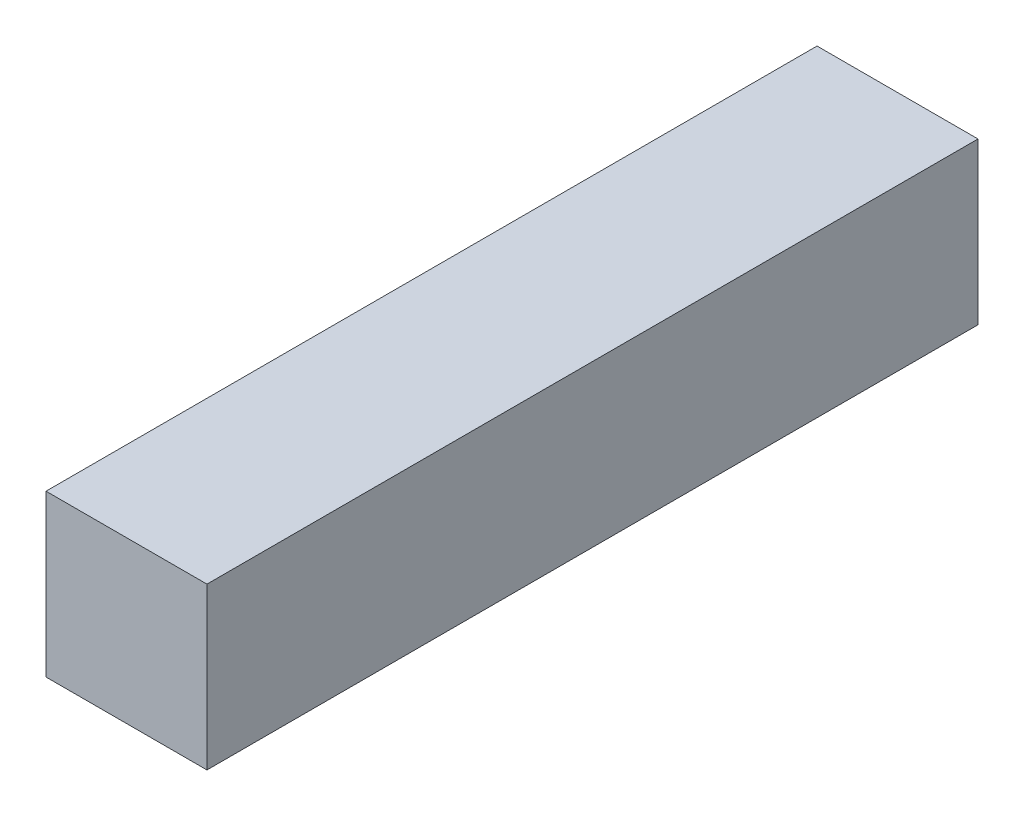
ISO-10303-21;
HEADER;
FILE_DESCRIPTION(('STEP AP214'),'2;1');
FILE_NAME('part.step','',(''),(''),'','','');
FILE_SCHEMA(('AUTOMOTIVE_DESIGN { 1 0 10303 214 1 1 1 1 }'));
ENDSEC;
DATA;
#1=APPLICATION_CONTEXT('core data for automotive mechanical design processes');
#2=APPLICATION_PROTOCOL_DEFINITION('international standard','automotive_design',2000,#1);
#3=PRODUCT_CONTEXT('',#1,'mechanical');
#4=PRODUCT('Part','Part','',(#3));
#5=PRODUCT_RELATED_PRODUCT_CATEGORY('part','',(#4));
#6=PRODUCT_DEFINITION_FORMATION('','',#4);
#7=PRODUCT_DEFINITION_CONTEXT('part definition',#1,'design');
#8=PRODUCT_DEFINITION('design','',#6,#7);
#9=PRODUCT_DEFINITION_SHAPE('','',#8);
#10=(LENGTH_UNIT() NAMED_UNIT(*) SI_UNIT(.MILLI.,.METRE.));
#11=(NAMED_UNIT(*) PLANE_ANGLE_UNIT() SI_UNIT($,.RADIAN.));
#12=(NAMED_UNIT(*) SI_UNIT($,.STERADIAN.) SOLID_ANGLE_UNIT());
#13=UNCERTAINTY_MEASURE_WITH_UNIT(LENGTH_MEASURE(1.E-05),#10,'distance_accuracy_value','');
#14=(GEOMETRIC_REPRESENTATION_CONTEXT(3) GLOBAL_UNCERTAINTY_ASSIGNED_CONTEXT((#13)) GLOBAL_UNIT_ASSIGNED_CONTEXT((#10,
#11,#12)) REPRESENTATION_CONTEXT('',''));
#15=CARTESIAN_POINT('',(0.,0.,0.));
#16=DIRECTION('',(0.,0.,1.));
#17=DIRECTION('',(1.,0.,0.));
#18=AXIS2_PLACEMENT_3D('',#15,#16,#17);
#19=CARTESIAN_POINT('',(8.35,-8.35,40.));
#20=DIRECTION('',(-1.,0.,0.));
#21=DIRECTION('',(0.,0.,1.));
#22=AXIS2_PLACEMENT_3D('',#19,#20,#21);
#23=PLANE('',#22);
#24=DIRECTION('',(0.,1.,0.));
#25=VECTOR('',#24,1.);
#26=CARTESIAN_POINT('',(8.35,-8.35,-40.));
#27=LINE('',#26,#25);
#28=CARTESIAN_POINT('',(8.35,-8.35,-40.));
#29=VERTEX_POINT('',#28);
#30=CARTESIAN_POINT('',(8.35,8.35,-40.));
#31=VERTEX_POINT('',#30);
#32=EDGE_CURVE('E100',#29,#31,#27,.T.);
#33=ORIENTED_EDGE('',*,*,#32,.T.);
#34=DIRECTION('',(0.,0.,-1.));
#35=VECTOR('',#34,1.);
#36=CARTESIAN_POINT('',(8.35,8.35,40.));
#37=LINE('',#36,#35);
#38=CARTESIAN_POINT('',(8.35,8.35,40.));
#39=VERTEX_POINT('',#38);
#40=EDGE_CURVE('E11',#39,#31,#37,.T.);
#41=ORIENTED_EDGE('',*,*,#40,.F.);
#42=DIRECTION('',(0.,1.,0.));
#43=VECTOR('',#42,1.);
#44=CARTESIAN_POINT('',(8.35,-8.35,40.));
#45=LINE('',#44,#43);
#46=CARTESIAN_POINT('',(8.35,-8.35,40.));
#47=VERTEX_POINT('',#46);
#48=EDGE_CURVE('E88',#47,#39,#45,.T.);
#49=ORIENTED_EDGE('',*,*,#48,.F.);
#50=DIRECTION('',(0.,0.,-1.));
#51=VECTOR('',#50,1.);
#52=CARTESIAN_POINT('',(8.35,-8.35,40.));
#53=LINE('',#52,#51);
#54=EDGE_CURVE('E96',#47,#29,#53,.T.);
#55=ORIENTED_EDGE('',*,*,#54,.T.);
#56=EDGE_LOOP('',(#33,#41,#49,#55));
#57=FACE_BOUND('',#56,.T.);
#58=ADVANCED_FACE('F37',(#57),#23,.F.);
#59=CARTESIAN_POINT('',(-8.35,8.35,40.));
#60=DIRECTION('',(0.,-1.,0.));
#61=DIRECTION('',(0.,0.,-1.));
#62=AXIS2_PLACEMENT_3D('',#59,#60,#61);
#63=PLANE('',#62);
#64=DIRECTION('',(-1.,0.,0.));
#65=VECTOR('',#64,1.);
#66=CARTESIAN_POINT('',(-8.35,8.35,-40.));
#67=LINE('',#66,#65);
#68=CARTESIAN_POINT('',(-8.35,8.35,-40.));
#69=VERTEX_POINT('',#68);
#70=EDGE_CURVE('E92',#31,#69,#67,.T.);
#71=ORIENTED_EDGE('',*,*,#70,.T.);
#72=DIRECTION('',(0.,0.,-1.));
#73=VECTOR('',#72,1.);
#74=CARTESIAN_POINT('',(-8.35,8.35,40.));
#75=LINE('',#74,#73);
#76=CARTESIAN_POINT('',(-8.35,8.35,40.));
#77=VERTEX_POINT('',#76);
#78=EDGE_CURVE('E45',#77,#69,#75,.T.);
#79=ORIENTED_EDGE('',*,*,#78,.F.);
#80=DIRECTION('',(-1.,0.,0.));
#81=VECTOR('',#80,1.);
#82=CARTESIAN_POINT('',(-8.35,8.35,40.));
#83=LINE('',#82,#81);
#84=EDGE_CURVE('E83',#39,#77,#83,.T.);
#85=ORIENTED_EDGE('',*,*,#84,.F.);
#86=ORIENTED_EDGE('',*,*,#40,.T.);
#87=EDGE_LOOP('',(#71,#79,#85,#86));
#88=FACE_BOUND('',#87,.T.);
#89=ADVANCED_FACE('F91',(#88),#63,.F.);
#90=CARTESIAN_POINT('',(-8.35,-8.35,40.));
#91=DIRECTION('',(1.,0.,0.));
#92=DIRECTION('',(0.,0.,-1.));
#93=AXIS2_PLACEMENT_3D('',#90,#91,#92);
#94=PLANE('',#93);
#95=DIRECTION('',(0.,-1.,0.));
#96=VECTOR('',#95,1.);
#97=CARTESIAN_POINT('',(-8.35,-8.35,-40.));
#98=LINE('',#97,#96);
#99=CARTESIAN_POINT('',(-8.35,-8.35,-40.));
#100=VERTEX_POINT('',#99);
#101=EDGE_CURVE('E70',#69,#100,#98,.T.);
#102=ORIENTED_EDGE('',*,*,#101,.T.);
#103=DIRECTION('',(0.,0.,-1.));
#104=VECTOR('',#103,1.);
#105=CARTESIAN_POINT('',(-8.35,-8.35,40.));
#106=LINE('',#105,#104);
#107=CARTESIAN_POINT('',(-8.35,-8.35,40.));
#108=VERTEX_POINT('',#107);
#109=EDGE_CURVE('E93',#108,#100,#106,.T.);
#110=ORIENTED_EDGE('',*,*,#109,.F.);
#111=DIRECTION('',(0.,-1.,0.));
#112=VECTOR('',#111,1.);
#113=CARTESIAN_POINT('',(-8.35,-8.35,40.));
#114=LINE('',#113,#112);
#115=EDGE_CURVE('E86',#77,#108,#114,.T.);
#116=ORIENTED_EDGE('',*,*,#115,.F.);
#117=ORIENTED_EDGE('',*,*,#78,.T.);
#118=EDGE_LOOP('',(#102,#110,#116,#117));
#119=FACE_BOUND('',#118,.T.);
#120=ADVANCED_FACE('F94',(#119),#94,.F.);
#121=CARTESIAN_POINT('',(-8.35,-8.35,40.));
#122=DIRECTION('',(0.,1.,0.));
#123=DIRECTION('',(0.,0.,1.));
#124=AXIS2_PLACEMENT_3D('',#121,#122,#123);
#125=PLANE('',#124);
#126=DIRECTION('',(1.,0.,0.));
#127=VECTOR('',#126,1.);
#128=CARTESIAN_POINT('',(-8.35,-8.35,-40.));
#129=LINE('',#128,#127);
#130=EDGE_CURVE('E76',#100,#29,#129,.T.);
#131=ORIENTED_EDGE('',*,*,#130,.T.);
#132=ORIENTED_EDGE('',*,*,#54,.F.);
#133=DIRECTION('',(1.,0.,0.));
#134=VECTOR('',#133,1.);
#135=CARTESIAN_POINT('',(-8.35,-8.35,40.));
#136=LINE('',#135,#134);
#137=EDGE_CURVE('E53',#108,#47,#136,.T.);
#138=ORIENTED_EDGE('',*,*,#137,.F.);
#139=ORIENTED_EDGE('',*,*,#109,.T.);
#140=EDGE_LOOP('',(#131,#132,#138,#139));
#141=FACE_BOUND('',#140,.T.);
#142=ADVANCED_FACE('F107',(#141),#125,.F.);
#143=CARTESIAN_POINT('',(0.,0.,40.));
#144=DIRECTION('',(0.,0.,-1.));
#145=DIRECTION('',(-1.,0.,0.));
#146=AXIS2_PLACEMENT_3D('',#143,#144,#145);
#147=PLANE('',#146);
#148=ORIENTED_EDGE('',*,*,#48,.T.);
#149=ORIENTED_EDGE('',*,*,#84,.T.);
#150=ORIENTED_EDGE('',*,*,#115,.T.);
#151=ORIENTED_EDGE('',*,*,#137,.T.);
#152=EDGE_LOOP('',(#148,#149,#150,#151));
#153=FACE_BOUND('',#152,.T.);
#154=ADVANCED_FACE('F84',(#153),#147,.F.);
#155=CARTESIAN_POINT('',(0.,0.,-40.));
#156=DIRECTION('',(0.,0.,-1.));
#157=DIRECTION('',(-1.,0.,0.));
#158=AXIS2_PLACEMENT_3D('',#155,#156,#157);
#159=PLANE('',#158);
#160=ORIENTED_EDGE('',*,*,#32,.F.);
#161=ORIENTED_EDGE('',*,*,#130,.F.);
#162=ORIENTED_EDGE('',*,*,#101,.F.);
#163=ORIENTED_EDGE('',*,*,#70,.F.);
#164=EDGE_LOOP('',(#160,#161,#162,#163));
#165=FACE_BOUND('',#164,.T.);
#166=ADVANCED_FACE('F110',(#165),#159,.T.);
#167=CLOSED_SHELL('',(#58,#89,#120,#142,#154,#166));
#168=MANIFOLD_SOLID_BREP('B2',#167);
#169=ADVANCED_BREP_SHAPE_REPRESENTATION('',(#18,#168),#14);
#170=SHAPE_DEFINITION_REPRESENTATION(#9,#169);
ENDSEC;
END-ISO-10303-21;
